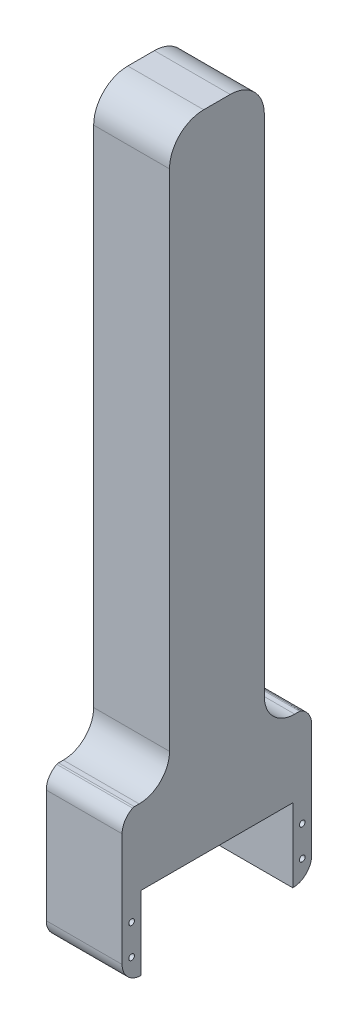
ISO-10303-21;
HEADER;
FILE_DESCRIPTION(('STEP AP214'),'2;1');
FILE_NAME('part.step','',(''),(''),'','','');
FILE_SCHEMA(('AUTOMOTIVE_DESIGN { 1 0 10303 214 1 1 1 1 }'));
ENDSEC;
DATA;
#1=APPLICATION_CONTEXT('core data for automotive mechanical design processes');
#2=APPLICATION_PROTOCOL_DEFINITION('international standard','automotive_design',2000,#1);
#3=PRODUCT_CONTEXT('',#1,'mechanical');
#4=PRODUCT('Part','Part','',(#3));
#5=PRODUCT_RELATED_PRODUCT_CATEGORY('part','',(#4));
#6=PRODUCT_DEFINITION_FORMATION('','',#4);
#7=PRODUCT_DEFINITION_CONTEXT('part definition',#1,'design');
#8=PRODUCT_DEFINITION('design','',#6,#7);
#9=PRODUCT_DEFINITION_SHAPE('','',#8);
#10=(LENGTH_UNIT() NAMED_UNIT(*) SI_UNIT(.MILLI.,.METRE.));
#11=(NAMED_UNIT(*) PLANE_ANGLE_UNIT() SI_UNIT($,.RADIAN.));
#12=(NAMED_UNIT(*) SI_UNIT($,.STERADIAN.) SOLID_ANGLE_UNIT());
#13=UNCERTAINTY_MEASURE_WITH_UNIT(LENGTH_MEASURE(1.E-05),#10,'distance_accuracy_value','');
#14=(GEOMETRIC_REPRESENTATION_CONTEXT(3) GLOBAL_UNCERTAINTY_ASSIGNED_CONTEXT((#13)) GLOBAL_UNIT_ASSIGNED_CONTEXT((#10,
#11,#12)) REPRESENTATION_CONTEXT('',''));
#15=CARTESIAN_POINT('',(0.,0.,0.));
#16=DIRECTION('',(0.,0.,1.));
#17=DIRECTION('',(1.,0.,0.));
#18=AXIS2_PLACEMENT_3D('',#15,#16,#17);
#19=CARTESIAN_POINT('',(20.,-63.953488372093,46.5891472868217));
#20=DIRECTION('',(0.,0.,1.));
#21=DIRECTION('',(1.,0.,0.));
#22=AXIS2_PLACEMENT_3D('',#19,#20,#21);
#23=PLANE('',#22);
#24=DIRECTION('',(0.,1.,0.));
#25=VECTOR('',#24,1.);
#26=CARTESIAN_POINT('',(20.,-63.953488372093,46.5891472868217));
#27=LINE('',#26,#25);
#28=CARTESIAN_POINT('',(20.,-63.3696868591887,46.5891472868217));
#29=VERTEX_POINT('',#28);
#30=CARTESIAN_POINT('',(20.,-43.953488372093,46.5891472868217));
#31=VERTEX_POINT('',#30);
#32=EDGE_CURVE('E197',#29,#31,#27,.T.);
#33=ORIENTED_EDGE('',*,*,#32,.F.);
#34=DIRECTION('',(-1.,0.,0.));
#35=VECTOR('',#34,1.);
#36=CARTESIAN_POINT('',(20.,-63.3696868591887,46.5891472868217));
#37=LINE('',#36,#35);
#38=CARTESIAN_POINT('',(0.,-63.3696868591887,46.5891472868217));
#39=VERTEX_POINT('',#38);
#40=EDGE_CURVE('E181',#29,#39,#37,.T.);
#41=ORIENTED_EDGE('',*,*,#40,.T.);
#42=DIRECTION('',(0.,1.,0.));
#43=VECTOR('',#42,1.);
#44=CARTESIAN_POINT('',(0.,-63.953488372093,46.5891472868217));
#45=LINE('',#44,#43);
#46=CARTESIAN_POINT('',(0.,-43.953488372093,46.5891472868217));
#47=VERTEX_POINT('',#46);
#48=EDGE_CURVE('E238',#39,#47,#45,.T.);
#49=ORIENTED_EDGE('',*,*,#48,.T.);
#50=DIRECTION('',(-1.,0.,0.));
#51=VECTOR('',#50,1.);
#52=CARTESIAN_POINT('',(20.,-43.953488372093,46.5891472868217));
#53=LINE('',#52,#51);
#54=EDGE_CURVE('E205',#31,#47,#53,.T.);
#55=ORIENTED_EDGE('',*,*,#54,.F.);
#56=EDGE_LOOP('',(#33,#41,#49,#55));
#57=FACE_BOUND('',#56,.T.);
#58=ADVANCED_FACE('F44',(#57),#23,.F.);
#59=CARTESIAN_POINT('',(20.,-43.953488372093,46.5891472868217));
#60=DIRECTION('',(0.,1.,0.));
#61=DIRECTION('',(0.,0.,1.));
#62=AXIS2_PLACEMENT_3D('',#59,#60,#61);
#63=PLANE('',#62);
#64=DIRECTION('',(0.,0.,-1.));
#65=VECTOR('',#64,1.);
#66=CARTESIAN_POINT('',(0.,-43.953488372093,46.5891472868217));
#67=LINE('',#66,#65);
#68=CARTESIAN_POINT('',(0.,-43.953488372093,6.58914728682172));
#69=VERTEX_POINT('',#68);
#70=EDGE_CURVE('E240',#47,#69,#67,.T.);
#71=ORIENTED_EDGE('',*,*,#70,.T.);
#72=DIRECTION('',(-1.,0.,0.));
#73=VECTOR('',#72,1.);
#74=CARTESIAN_POINT('',(20.,-43.953488372093,6.58914728682172));
#75=LINE('',#74,#73);
#76=CARTESIAN_POINT('',(20.,-43.953488372093,6.58914728682172));
#77=VERTEX_POINT('',#76);
#78=EDGE_CURVE('E284',#77,#69,#75,.T.);
#79=ORIENTED_EDGE('',*,*,#78,.F.);
#80=DIRECTION('',(0.,0.,-1.));
#81=VECTOR('',#80,1.);
#82=CARTESIAN_POINT('',(20.,-43.953488372093,46.5891472868217));
#83=LINE('',#82,#81);
#84=EDGE_CURVE('E206',#31,#77,#83,.T.);
#85=ORIENTED_EDGE('',*,*,#84,.F.);
#86=ORIENTED_EDGE('',*,*,#54,.T.);
#87=EDGE_LOOP('',(#71,#79,#85,#86));
#88=FACE_BOUND('',#87,.T.);
#89=ADVANCED_FACE('F384',(#88),#63,.F.);
#90=CARTESIAN_POINT('',(20.,-43.953488372093,6.58914728682172));
#91=DIRECTION('',(0.,0.,-1.));
#92=DIRECTION('',(-1.,0.,0.));
#93=AXIS2_PLACEMENT_3D('',#90,#91,#92);
#94=PLANE('',#93);
#95=DIRECTION('',(0.,-1.,0.));
#96=VECTOR('',#95,1.);
#97=CARTESIAN_POINT('',(0.,-43.953488372093,6.58914728682172));
#98=LINE('',#97,#96);
#99=CARTESIAN_POINT('',(0.,-63.3696868591887,6.58914728682176));
#100=VERTEX_POINT('',#99);
#101=EDGE_CURVE('E243',#69,#100,#98,.T.);
#102=ORIENTED_EDGE('',*,*,#101,.T.);
#103=DIRECTION('',(-1.,0.,0.));
#104=VECTOR('',#103,1.);
#105=CARTESIAN_POINT('',(20.,-63.3696868591887,6.58914728682176));
#106=LINE('',#105,#104);
#107=CARTESIAN_POINT('',(20.,-63.3696868591887,6.58914728682176));
#108=VERTEX_POINT('',#107);
#109=EDGE_CURVE('E342',#108,#100,#106,.T.);
#110=ORIENTED_EDGE('',*,*,#109,.F.);
#111=DIRECTION('',(0.,-1.,0.));
#112=VECTOR('',#111,1.);
#113=CARTESIAN_POINT('',(20.,-43.953488372093,6.58914728682172));
#114=LINE('',#113,#112);
#115=EDGE_CURVE('E209',#77,#108,#114,.T.);
#116=ORIENTED_EDGE('',*,*,#115,.F.);
#117=ORIENTED_EDGE('',*,*,#78,.T.);
#118=EDGE_LOOP('',(#102,#110,#116,#117));
#119=FACE_BOUND('',#118,.T.);
#120=ADVANCED_FACE('F389',(#119),#94,.F.);
#121=CARTESIAN_POINT('',(20.,-23.953488372093,4.58914728682179));
#122=DIRECTION('',(0.,-1.,0.));
#123=DIRECTION('',(0.,0.,-1.));
#124=AXIS2_PLACEMENT_3D('',#121,#122,#123);
#125=PLANE('',#124);
#126=DIRECTION('',(0.,0.,1.));
#127=VECTOR('',#126,1.);
#128=CARTESIAN_POINT('',(20.,-23.953488372093,4.58914728682179));
#129=LINE('',#128,#127);
#130=CARTESIAN_POINT('',(20.,-23.953488372093,4.81006005177351));
#131=VERTEX_POINT('',#130);
#132=CARTESIAN_POINT('',(20.,-23.953488372093,6.08914728682167));
#133=VERTEX_POINT('',#132);
#134=EDGE_CURVE('E219',#131,#133,#129,.T.);
#135=ORIENTED_EDGE('',*,*,#134,.F.);
#136=DIRECTION('',(1.,0.,0.));
#137=VECTOR('',#136,1.);
#138=CARTESIAN_POINT('',(0.,-23.953488372093,4.81006005177351));
#139=LINE('',#138,#137);
#140=CARTESIAN_POINT('',(0.,-23.953488372093,4.81006005177351));
#141=VERTEX_POINT('',#140);
#142=EDGE_CURVE('E295',#131,#141,#139,.F.);
#143=ORIENTED_EDGE('',*,*,#142,.T.);
#144=DIRECTION('',(0.,0.,1.));
#145=VECTOR('',#144,1.);
#146=CARTESIAN_POINT('',(0.,-23.953488372093,4.58914728682179));
#147=LINE('',#146,#145);
#148=CARTESIAN_POINT('',(0.,-23.953488372093,6.08914728682167));
#149=VERTEX_POINT('',#148);
#150=EDGE_CURVE('E246',#141,#149,#147,.T.);
#151=ORIENTED_EDGE('',*,*,#150,.T.);
#152=DIRECTION('',(-1.,0.,0.));
#153=VECTOR('',#152,1.);
#154=CARTESIAN_POINT('',(20.,-23.953488372093,6.08914728682167));
#155=LINE('',#154,#153);
#156=EDGE_CURVE('E281',#133,#149,#155,.T.);
#157=ORIENTED_EDGE('',*,*,#156,.F.);
#158=EDGE_LOOP('',(#135,#143,#151,#157));
#159=FACE_BOUND('',#158,.T.);
#160=ADVANCED_FACE('F447',(#159),#125,.F.);
#161=CARTESIAN_POINT('',(20.,-15.953488372093,6.08914728682172));
#162=DIRECTION('',(-1.,0.,0.));
#163=DIRECTION('',(0.,0.,1.));
#164=AXIS2_PLACEMENT_3D('',#161,#162,#163);
#165=CYLINDRICAL_SURFACE('',#164,8.);
#166=CARTESIAN_POINT('',(0.,-15.953488372093,6.08914728682172));
#167=DIRECTION('',(-1.,0.,0.));
#168=DIRECTION('',(0.,0.,-1.));
#169=AXIS2_PLACEMENT_3D('',#166,#167,#168);
#170=CIRCLE('',#169,8.);
#171=CARTESIAN_POINT('',(0.,-15.953488372093,14.0891472868217));
#172=VERTEX_POINT('',#171);
#173=EDGE_CURVE('E248',#149,#172,#170,.T.);
#174=ORIENTED_EDGE('',*,*,#173,.T.);
#175=DIRECTION('',(-1.,0.,0.));
#176=VECTOR('',#175,1.);
#177=CARTESIAN_POINT('',(20.,-15.953488372093,14.0891472868217));
#178=LINE('',#177,#176);
#179=CARTESIAN_POINT('',(20.,-15.953488372093,14.0891472868217));
#180=VERTEX_POINT('',#179);
#181=EDGE_CURVE('E278',#180,#172,#178,.T.);
#182=ORIENTED_EDGE('',*,*,#181,.F.);
#183=CARTESIAN_POINT('',(20.,-15.953488372093,6.08914728682172));
#184=DIRECTION('',(-1.,0.,0.));
#185=DIRECTION('',(0.,0.,-1.));
#186=AXIS2_PLACEMENT_3D('',#183,#184,#185);
#187=CIRCLE('',#186,8.);
#188=EDGE_CURVE('E221',#133,#180,#187,.T.);
#189=ORIENTED_EDGE('',*,*,#188,.F.);
#190=ORIENTED_EDGE('',*,*,#156,.T.);
#191=EDGE_LOOP('',(#174,#182,#189,#190));
#192=FACE_BOUND('',#191,.T.);
#193=ADVANCED_FACE('F442',(#192),#165,.F.);
#194=CARTESIAN_POINT('',(20.,-15.953488372093,14.0891472868217));
#195=DIRECTION('',(0.,0.,1.));
#196=DIRECTION('',(1.,0.,0.));
#197=AXIS2_PLACEMENT_3D('',#194,#195,#196);
#198=PLANE('',#197);
#199=DIRECTION('',(0.,1.,0.));
#200=VECTOR('',#199,1.);
#201=CARTESIAN_POINT('',(0.,-15.953488372093,14.0891472868217));
#202=LINE('',#201,#200);
#203=CARTESIAN_POINT('',(0.,117.046511627907,14.0891472868217));
#204=VERTEX_POINT('',#203);
#205=EDGE_CURVE('E250',#172,#204,#202,.T.);
#206=ORIENTED_EDGE('',*,*,#205,.T.);
#207=DIRECTION('',(-1.,0.,0.));
#208=VECTOR('',#207,1.);
#209=CARTESIAN_POINT('',(20.,117.046511627907,14.0891472868217));
#210=LINE('',#209,#208);
#211=CARTESIAN_POINT('',(20.,117.046511627907,14.0891472868217));
#212=VERTEX_POINT('',#211);
#213=EDGE_CURVE('E275',#212,#204,#210,.T.);
#214=ORIENTED_EDGE('',*,*,#213,.F.);
#215=DIRECTION('',(0.,1.,0.));
#216=VECTOR('',#215,1.);
#217=CARTESIAN_POINT('',(20.,-15.953488372093,14.0891472868217));
#218=LINE('',#217,#216);
#219=EDGE_CURVE('E223',#180,#212,#218,.T.);
#220=ORIENTED_EDGE('',*,*,#219,.F.);
#221=ORIENTED_EDGE('',*,*,#181,.T.);
#222=EDGE_LOOP('',(#206,#214,#220,#221));
#223=FACE_BOUND('',#222,.T.);
#224=ADVANCED_FACE('F437',(#223),#198,.F.);
#225=CARTESIAN_POINT('',(20.,117.046511627907,23.0891472868217));
#226=DIRECTION('',(-1.,0.,0.));
#227=DIRECTION('',(0.,0.,1.));
#228=AXIS2_PLACEMENT_3D('',#225,#226,#227);
#229=CYLINDRICAL_SURFACE('',#228,9.);
#230=CARTESIAN_POINT('',(0.,117.046511627907,23.0891472868217));
#231=DIRECTION('',(1.,0.,0.));
#232=DIRECTION('',(0.,0.,-1.));
#233=AXIS2_PLACEMENT_3D('',#230,#231,#232);
#234=CIRCLE('',#233,9.);
#235=CARTESIAN_POINT('',(0.,126.046511627907,23.0891472868218));
#236=VERTEX_POINT('',#235);
#237=EDGE_CURVE('E252',#204,#236,#234,.T.);
#238=ORIENTED_EDGE('',*,*,#237,.T.);
#239=DIRECTION('',(-1.,0.,0.));
#240=VECTOR('',#239,1.);
#241=CARTESIAN_POINT('',(20.,126.046511627907,23.0891472868218));
#242=LINE('',#241,#240);
#243=CARTESIAN_POINT('',(20.,126.046511627907,23.0891472868218));
#244=VERTEX_POINT('',#243);
#245=EDGE_CURVE('E272',#244,#236,#242,.T.);
#246=ORIENTED_EDGE('',*,*,#245,.F.);
#247=CARTESIAN_POINT('',(20.,117.046511627907,23.0891472868217));
#248=DIRECTION('',(1.,0.,0.));
#249=DIRECTION('',(0.,0.,-1.));
#250=AXIS2_PLACEMENT_3D('',#247,#248,#249);
#251=CIRCLE('',#250,9.);
#252=EDGE_CURVE('E225',#212,#244,#251,.T.);
#253=ORIENTED_EDGE('',*,*,#252,.F.);
#254=ORIENTED_EDGE('',*,*,#213,.T.);
#255=EDGE_LOOP('',(#238,#246,#253,#254));
#256=FACE_BOUND('',#255,.T.);
#257=ADVANCED_FACE('F433',(#256),#229,.T.);
#258=CARTESIAN_POINT('',(20.,126.046511627907,30.0891472868217));
#259=DIRECTION('',(0.,-1.,0.));
#260=DIRECTION('',(0.,0.,-1.));
#261=AXIS2_PLACEMENT_3D('',#258,#259,#260);
#262=PLANE('',#261);
#263=DIRECTION('',(0.,0.,1.));
#264=VECTOR('',#263,1.);
#265=CARTESIAN_POINT('',(0.,126.046511627907,30.0891472868217));
#266=LINE('',#265,#264);
#267=CARTESIAN_POINT('',(0.,126.046511627907,30.0891472868217));
#268=VERTEX_POINT('',#267);
#269=EDGE_CURVE('E254',#236,#268,#266,.T.);
#270=ORIENTED_EDGE('',*,*,#269,.T.);
#271=DIRECTION('',(-1.,0.,0.));
#272=VECTOR('',#271,1.);
#273=CARTESIAN_POINT('',(20.,126.046511627907,30.0891472868217));
#274=LINE('',#273,#272);
#275=CARTESIAN_POINT('',(20.,126.046511627907,30.0891472868217));
#276=VERTEX_POINT('',#275);
#277=EDGE_CURVE('E269',#276,#268,#274,.T.);
#278=ORIENTED_EDGE('',*,*,#277,.F.);
#279=DIRECTION('',(0.,0.,1.));
#280=VECTOR('',#279,1.);
#281=CARTESIAN_POINT('',(20.,126.046511627907,30.0891472868217));
#282=LINE('',#281,#280);
#283=EDGE_CURVE('E227',#244,#276,#282,.T.);
#284=ORIENTED_EDGE('',*,*,#283,.F.);
#285=ORIENTED_EDGE('',*,*,#245,.T.);
#286=EDGE_LOOP('',(#270,#278,#284,#285));
#287=FACE_BOUND('',#286,.T.);
#288=ADVANCED_FACE('F428',(#287),#262,.F.);
#289=CARTESIAN_POINT('',(20.,117.046511627907,30.0891472868217));
#290=DIRECTION('',(-1.,0.,0.));
#291=DIRECTION('',(0.,0.,1.));
#292=AXIS2_PLACEMENT_3D('',#289,#290,#291);
#293=CYLINDRICAL_SURFACE('',#292,9.);
#294=CARTESIAN_POINT('',(0.,117.046511627907,30.0891472868217));
#295=DIRECTION('',(1.,0.,0.));
#296=DIRECTION('',(0.,0.,-1.));
#297=AXIS2_PLACEMENT_3D('',#294,#295,#296);
#298=CIRCLE('',#297,9.);
#299=CARTESIAN_POINT('',(0.,117.046511627907,39.0891472868217));
#300=VERTEX_POINT('',#299);
#301=EDGE_CURVE('E256',#268,#300,#298,.T.);
#302=ORIENTED_EDGE('',*,*,#301,.T.);
#303=DIRECTION('',(-1.,0.,0.));
#304=VECTOR('',#303,1.);
#305=CARTESIAN_POINT('',(20.,117.046511627907,39.0891472868217));
#306=LINE('',#305,#304);
#307=CARTESIAN_POINT('',(20.,117.046511627907,39.0891472868217));
#308=VERTEX_POINT('',#307);
#309=EDGE_CURVE('E266',#308,#300,#306,.T.);
#310=ORIENTED_EDGE('',*,*,#309,.F.);
#311=CARTESIAN_POINT('',(20.,117.046511627907,30.0891472868217));
#312=DIRECTION('',(1.,0.,0.));
#313=DIRECTION('',(0.,0.,-1.));
#314=AXIS2_PLACEMENT_3D('',#311,#312,#313);
#315=CIRCLE('',#314,9.);
#316=EDGE_CURVE('E229',#276,#308,#315,.T.);
#317=ORIENTED_EDGE('',*,*,#316,.F.);
#318=ORIENTED_EDGE('',*,*,#277,.T.);
#319=EDGE_LOOP('',(#302,#310,#317,#318));
#320=FACE_BOUND('',#319,.T.);
#321=ADVANCED_FACE('F422',(#320),#293,.T.);
#322=CARTESIAN_POINT('',(20.,-15.953488372093,39.0891472868217));
#323=DIRECTION('',(0.,0.,-1.));
#324=DIRECTION('',(-1.,0.,0.));
#325=AXIS2_PLACEMENT_3D('',#322,#323,#324);
#326=PLANE('',#325);
#327=DIRECTION('',(0.,-1.,0.));
#328=VECTOR('',#327,1.);
#329=CARTESIAN_POINT('',(0.,-15.953488372093,39.0891472868217));
#330=LINE('',#329,#328);
#331=CARTESIAN_POINT('',(0.,-15.953488372093,39.0891472868217));
#332=VERTEX_POINT('',#331);
#333=EDGE_CURVE('E258',#300,#332,#330,.T.);
#334=ORIENTED_EDGE('',*,*,#333,.T.);
#335=DIRECTION('',(-1.,0.,0.));
#336=VECTOR('',#335,1.);
#337=CARTESIAN_POINT('',(20.,-15.953488372093,39.0891472868217));
#338=LINE('',#337,#336);
#339=CARTESIAN_POINT('',(20.,-15.953488372093,39.0891472868217));
#340=VERTEX_POINT('',#339);
#341=EDGE_CURVE('E263',#340,#332,#338,.T.);
#342=ORIENTED_EDGE('',*,*,#341,.F.);
#343=DIRECTION('',(0.,-1.,0.));
#344=VECTOR('',#343,1.);
#345=CARTESIAN_POINT('',(20.,-15.953488372093,39.0891472868217));
#346=LINE('',#345,#344);
#347=EDGE_CURVE('E231',#308,#340,#346,.T.);
#348=ORIENTED_EDGE('',*,*,#347,.F.);
#349=ORIENTED_EDGE('',*,*,#309,.T.);
#350=EDGE_LOOP('',(#334,#342,#348,#349));
#351=FACE_BOUND('',#350,.T.);
#352=ADVANCED_FACE('F418',(#351),#326,.F.);
#353=CARTESIAN_POINT('',(20.,-15.953488372093,47.0891472868217));
#354=DIRECTION('',(-1.,0.,0.));
#355=DIRECTION('',(0.,0.,1.));
#356=AXIS2_PLACEMENT_3D('',#353,#354,#355);
#357=CYLINDRICAL_SURFACE('',#356,8.);
#358=CARTESIAN_POINT('',(0.,-15.953488372093,47.0891472868217));
#359=DIRECTION('',(-1.,0.,0.));
#360=DIRECTION('',(0.,0.,-1.));
#361=AXIS2_PLACEMENT_3D('',#358,#359,#360);
#362=CIRCLE('',#361,8.);
#363=CARTESIAN_POINT('',(0.,-23.953488372093,47.0891472868218));
#364=VERTEX_POINT('',#363);
#365=EDGE_CURVE('E211',#332,#364,#362,.T.);
#366=ORIENTED_EDGE('',*,*,#365,.T.);
#367=DIRECTION('',(-1.,0.,0.));
#368=VECTOR('',#367,1.);
#369=CARTESIAN_POINT('',(20.,-23.953488372093,47.0891472868218));
#370=LINE('',#369,#368);
#371=CARTESIAN_POINT('',(20.,-23.953488372093,47.0891472868218));
#372=VERTEX_POINT('',#371);
#373=EDGE_CURVE('E237',#372,#364,#370,.T.);
#374=ORIENTED_EDGE('',*,*,#373,.F.);
#375=CARTESIAN_POINT('',(20.,-15.953488372093,47.0891472868217));
#376=DIRECTION('',(-1.,0.,0.));
#377=DIRECTION('',(0.,0.,-1.));
#378=AXIS2_PLACEMENT_3D('',#375,#376,#377);
#379=CIRCLE('',#378,8.);
#380=EDGE_CURVE('E233',#340,#372,#379,.T.);
#381=ORIENTED_EDGE('',*,*,#380,.F.);
#382=ORIENTED_EDGE('',*,*,#341,.T.);
#383=EDGE_LOOP('',(#366,#374,#381,#382));
#384=FACE_BOUND('',#383,.T.);
#385=ADVANCED_FACE('F414',(#384),#357,.F.);
#386=CARTESIAN_POINT('',(20.,-23.953488372093,48.5891472868217));
#387=DIRECTION('',(0.,-1.,0.));
#388=DIRECTION('',(0.,0.,-1.));
#389=AXIS2_PLACEMENT_3D('',#386,#387,#388);
#390=PLANE('',#389);
#391=DIRECTION('',(0.,0.,1.));
#392=VECTOR('',#391,1.);
#393=CARTESIAN_POINT('',(0.,-23.953488372093,48.5891472868217));
#394=LINE('',#393,#392);
#395=CARTESIAN_POINT('',(0.,-23.953488372093,48.36823452187));
#396=VERTEX_POINT('',#395);
#397=EDGE_CURVE('E207',#364,#396,#394,.T.);
#398=ORIENTED_EDGE('',*,*,#397,.T.);
#399=DIRECTION('',(1.,0.,0.));
#400=VECTOR('',#399,1.);
#401=CARTESIAN_POINT('',(20.,-23.953488372093,48.36823452187));
#402=LINE('',#401,#400);
#403=CARTESIAN_POINT('',(20.,-23.953488372093,48.36823452187));
#404=VERTEX_POINT('',#403);
#405=EDGE_CURVE('E52',#396,#404,#402,.T.);
#406=ORIENTED_EDGE('',*,*,#405,.T.);
#407=DIRECTION('',(0.,0.,1.));
#408=VECTOR('',#407,1.);
#409=CARTESIAN_POINT('',(20.,-23.953488372093,48.5891472868217));
#410=LINE('',#409,#408);
#411=EDGE_CURVE('E235',#372,#404,#410,.T.);
#412=ORIENTED_EDGE('',*,*,#411,.F.);
#413=ORIENTED_EDGE('',*,*,#373,.T.);
#414=EDGE_LOOP('',(#398,#406,#412,#413));
#415=FACE_BOUND('',#414,.T.);
#416=ADVANCED_FACE('F380',(#415),#390,.F.);
#417=CARTESIAN_POINT('',(20.,-55.953488372093,4.58914728682172));
#418=DIRECTION('',(-1.,0.,0.));
#419=DIRECTION('',(0.,0.,1.));
#420=AXIS2_PLACEMENT_3D('',#417,#418,#419);
#421=PLANE('',#420);
#422=ORIENTED_EDGE('',*,*,#411,.T.);
#423=CARTESIAN_POINT('',(20.,-24.953488372093,48.36823452187));
#424=DIRECTION('',(-1.,0.,0.));
#425=DIRECTION('',(0.,0.,1.));
#426=AXIS2_PLACEMENT_3D('',#423,#424,#425);
#427=CIRCLE('',#426,1.);
#428=CARTESIAN_POINT('',(20.,-24.0578444483541,48.813006330632));
#429=VERTEX_POINT('',#428);
#430=EDGE_CURVE('E13',#404,#429,#427,.F.);
#431=ORIENTED_EDGE('',*,*,#430,.T.);
#432=CARTESIAN_POINT('',(20.,-28.5360640670489,46.5891472868217));
#433=DIRECTION('',(-1.,0.,0.));
#434=DIRECTION('',(0.,0.,1.));
#435=AXIS2_PLACEMENT_3D('',#432,#433,#434);
#436=CIRCLE('',#435,5.);
#437=CARTESIAN_POINT('',(20.,-28.5360640670489,51.5891472868217));
#438=VERTEX_POINT('',#437);
#439=EDGE_CURVE('E304',#429,#438,#436,.F.);
#440=ORIENTED_EDGE('',*,*,#439,.T.);
#441=DIRECTION('',(0.,-1.,0.));
#442=VECTOR('',#441,1.);
#443=CARTESIAN_POINT('',(20.,-43.953488372093,51.5891472868217));
#444=LINE('',#443,#442);
#445=CARTESIAN_POINT('',(20.,-58.3696868591887,51.5891472868217));
#446=VERTEX_POINT('',#445);
#447=EDGE_CURVE('E192',#438,#446,#444,.T.);
#448=ORIENTED_EDGE('',*,*,#447,.T.);
#449=CARTESIAN_POINT('',(20.,-58.3696868591887,46.5891472868217));
#450=DIRECTION('',(1.,0.,0.));
#451=DIRECTION('',(0.,0.,-1.));
#452=AXIS2_PLACEMENT_3D('',#449,#450,#451);
#453=CIRCLE('',#452,5.);
#454=EDGE_CURVE('E185',#446,#29,#453,.T.);
#455=ORIENTED_EDGE('',*,*,#454,.T.);
#456=ORIENTED_EDGE('',*,*,#32,.T.);
#457=ORIENTED_EDGE('',*,*,#84,.T.);
#458=ORIENTED_EDGE('',*,*,#115,.T.);
#459=CARTESIAN_POINT('',(20.,-58.3696868591887,6.58914728682172));
#460=DIRECTION('',(1.,0.,0.));
#461=DIRECTION('',(0.,0.,1.));
#462=AXIS2_PLACEMENT_3D('',#459,#460,#461);
#463=CIRCLE('',#462,5.);
#464=CARTESIAN_POINT('',(20.,-58.3696868591887,1.58914728682172));
#465=VERTEX_POINT('',#464);
#466=EDGE_CURVE('E331',#108,#465,#463,.T.);
#467=ORIENTED_EDGE('',*,*,#466,.T.);
#468=DIRECTION('',(0.,1.,0.));
#469=VECTOR('',#468,1.);
#470=CARTESIAN_POINT('',(20.,-43.953488372093,1.58914728682172));
#471=LINE('',#470,#469);
#472=CARTESIAN_POINT('',(20.,-28.5360640670489,1.58914728682172));
#473=VERTEX_POINT('',#472);
#474=EDGE_CURVE('E334',#465,#473,#471,.T.);
#475=ORIENTED_EDGE('',*,*,#474,.T.);
#476=CARTESIAN_POINT('',(20.,-28.5360640670489,6.58914728682172));
#477=DIRECTION('',(-1.,0.,0.));
#478=DIRECTION('',(0.,0.,1.));
#479=AXIS2_PLACEMENT_3D('',#476,#477,#478);
#480=CIRCLE('',#479,5.);
#481=CARTESIAN_POINT('',(20.,-24.0578444483541,4.36528824301146));
#482=VERTEX_POINT('',#481);
#483=EDGE_CURVE('E292',#473,#482,#480,.F.);
#484=ORIENTED_EDGE('',*,*,#483,.T.);
#485=CARTESIAN_POINT('',(20.,-24.953488372093,4.81006005177351));
#486=DIRECTION('',(-1.,0.,0.));
#487=DIRECTION('',(0.,0.,1.));
#488=AXIS2_PLACEMENT_3D('',#485,#486,#487);
#489=CIRCLE('',#488,1.);
#490=EDGE_CURVE('E302',#482,#131,#489,.F.);
#491=ORIENTED_EDGE('',*,*,#490,.T.);
#492=ORIENTED_EDGE('',*,*,#134,.T.);
#493=ORIENTED_EDGE('',*,*,#188,.T.);
#494=ORIENTED_EDGE('',*,*,#219,.T.);
#495=ORIENTED_EDGE('',*,*,#252,.T.);
#496=ORIENTED_EDGE('',*,*,#283,.T.);
#497=ORIENTED_EDGE('',*,*,#316,.T.);
#498=ORIENTED_EDGE('',*,*,#347,.T.);
#499=ORIENTED_EDGE('',*,*,#380,.T.);
#500=EDGE_LOOP('',(#422,#431,#440,#448,#455,#456,#457,#458,#467,#475,#484,#491,#492,#493,#494,
#495,#496,#497,#498,#499));
#501=FACE_BOUND('',#500,.T.);
#502=CARTESIAN_POINT('',(20.,-57.953488372093,4.08914728682172));
#503=DIRECTION('',(-1.,0.,0.));
#504=DIRECTION('',(0.,0.,-1.));
#505=AXIS2_PLACEMENT_3D('',#502,#503,#504);
#506=CIRCLE('',#505,0.75);
#507=CARTESIAN_POINT('',(20.,-57.953488372093,3.33914728682172));
#508=VERTEX_POINT('',#507);
#509=EDGE_CURVE('E347',#508,#508,#506,.T.);
#510=ORIENTED_EDGE('',*,*,#509,.T.);
#511=EDGE_LOOP('',(#510));
#512=FACE_BOUND('',#511,.T.);
#513=CARTESIAN_POINT('',(20.,-57.953488372093,49.0891472868217));
#514=DIRECTION('',(-1.,0.,0.));
#515=DIRECTION('',(0.,0.,1.));
#516=AXIS2_PLACEMENT_3D('',#513,#514,#515);
#517=CIRCLE('',#516,0.749999999999999);
#518=CARTESIAN_POINT('',(20.,-57.953488372093,49.8391472868217));
#519=VERTEX_POINT('',#518);
#520=EDGE_CURVE('E353',#519,#519,#517,.T.);
#521=ORIENTED_EDGE('',*,*,#520,.T.);
#522=EDGE_LOOP('',(#521));
#523=FACE_BOUND('',#522,.T.);
#524=CARTESIAN_POINT('',(20.,-49.953488372093,49.0891472868217));
#525=DIRECTION('',(-1.,0.,0.));
#526=DIRECTION('',(0.,0.,-1.));
#527=AXIS2_PLACEMENT_3D('',#524,#525,#526);
#528=CIRCLE('',#527,0.749999999999999);
#529=CARTESIAN_POINT('',(20.,-49.953488372093,48.3391472868217));
#530=VERTEX_POINT('',#529);
#531=EDGE_CURVE('E359',#530,#530,#528,.T.);
#532=ORIENTED_EDGE('',*,*,#531,.T.);
#533=EDGE_LOOP('',(#532));
#534=FACE_BOUND('',#533,.T.);
#535=CARTESIAN_POINT('',(20.,-49.953488372093,4.08914728682172));
#536=DIRECTION('',(-1.,0.,0.));
#537=DIRECTION('',(0.,0.,1.));
#538=AXIS2_PLACEMENT_3D('',#535,#536,#537);
#539=CIRCLE('',#538,0.75);
#540=CARTESIAN_POINT('',(20.,-49.953488372093,4.83914728682172));
#541=VERTEX_POINT('',#540);
#542=EDGE_CURVE('E241',#541,#541,#539,.T.);
#543=ORIENTED_EDGE('',*,*,#542,.T.);
#544=EDGE_LOOP('',(#543));
#545=FACE_BOUND('',#544,.T.);
#546=ADVANCED_FACE('F195',(#501,#512,#523,#534,#545),#421,.F.);
#547=CARTESIAN_POINT('',(0.,-55.953488372093,4.58914728682172));
#548=DIRECTION('',(-1.,0.,0.));
#549=DIRECTION('',(0.,0.,1.));
#550=AXIS2_PLACEMENT_3D('',#547,#548,#549);
#551=PLANE('',#550);
#552=CARTESIAN_POINT('',(0.,-28.5360640670489,46.5891472868217));
#553=DIRECTION('',(-1.,0.,0.));
#554=DIRECTION('',(0.,0.,1.));
#555=AXIS2_PLACEMENT_3D('',#552,#553,#554);
#556=CIRCLE('',#555,5.);
#557=CARTESIAN_POINT('',(0.,-28.5360640670489,51.5891472868217));
#558=VERTEX_POINT('',#557);
#559=CARTESIAN_POINT('',(0.,-24.0578444483541,48.813006330632));
#560=VERTEX_POINT('',#559);
#561=EDGE_CURVE('E308',#558,#560,#556,.T.);
#562=ORIENTED_EDGE('',*,*,#561,.T.);
#563=CARTESIAN_POINT('',(0.,-24.953488372093,48.36823452187));
#564=DIRECTION('',(-1.,0.,0.));
#565=DIRECTION('',(0.,0.,1.));
#566=AXIS2_PLACEMENT_3D('',#563,#564,#565);
#567=CIRCLE('',#566,1.);
#568=EDGE_CURVE('E66',#560,#396,#567,.T.);
#569=ORIENTED_EDGE('',*,*,#568,.T.);
#570=ORIENTED_EDGE('',*,*,#397,.F.);
#571=ORIENTED_EDGE('',*,*,#365,.F.);
#572=ORIENTED_EDGE('',*,*,#333,.F.);
#573=ORIENTED_EDGE('',*,*,#301,.F.);
#574=ORIENTED_EDGE('',*,*,#269,.F.);
#575=ORIENTED_EDGE('',*,*,#237,.F.);
#576=ORIENTED_EDGE('',*,*,#205,.F.);
#577=ORIENTED_EDGE('',*,*,#173,.F.);
#578=ORIENTED_EDGE('',*,*,#150,.F.);
#579=CARTESIAN_POINT('',(0.,-24.953488372093,4.81006005177351));
#580=DIRECTION('',(-1.,0.,0.));
#581=DIRECTION('',(0.,0.,1.));
#582=AXIS2_PLACEMENT_3D('',#579,#580,#581);
#583=CIRCLE('',#582,1.);
#584=CARTESIAN_POINT('',(0.,-24.0578444483541,4.36528824301146));
#585=VERTEX_POINT('',#584);
#586=EDGE_CURVE('E298',#141,#585,#583,.T.);
#587=ORIENTED_EDGE('',*,*,#586,.T.);
#588=CARTESIAN_POINT('',(0.,-28.5360640670489,6.58914728682172));
#589=DIRECTION('',(-1.,0.,0.));
#590=DIRECTION('',(0.,0.,1.));
#591=AXIS2_PLACEMENT_3D('',#588,#589,#590);
#592=CIRCLE('',#591,5.);
#593=CARTESIAN_POINT('',(0.,-28.5360640670489,1.58914728682172));
#594=VERTEX_POINT('',#593);
#595=EDGE_CURVE('E288',#585,#594,#592,.T.);
#596=ORIENTED_EDGE('',*,*,#595,.T.);
#597=DIRECTION('',(0.,1.,0.));
#598=VECTOR('',#597,1.);
#599=CARTESIAN_POINT('',(0.,-43.953488372093,1.58914728682172));
#600=LINE('',#599,#598);
#601=CARTESIAN_POINT('',(0.,-58.3696868591887,1.58914728682172));
#602=VERTEX_POINT('',#601);
#603=EDGE_CURVE('E335',#602,#594,#600,.T.);
#604=ORIENTED_EDGE('',*,*,#603,.F.);
#605=CARTESIAN_POINT('',(0.,-58.3696868591887,6.58914728682172));
#606=DIRECTION('',(1.,0.,0.));
#607=DIRECTION('',(0.,0.,1.));
#608=AXIS2_PLACEMENT_3D('',#605,#606,#607);
#609=CIRCLE('',#608,5.);
#610=EDGE_CURVE('E329',#100,#602,#609,.T.);
#611=ORIENTED_EDGE('',*,*,#610,.F.);
#612=ORIENTED_EDGE('',*,*,#101,.F.);
#613=ORIENTED_EDGE('',*,*,#70,.F.);
#614=ORIENTED_EDGE('',*,*,#48,.F.);
#615=CARTESIAN_POINT('',(0.,-58.3696868591887,46.5891472868217));
#616=DIRECTION('',(1.,0.,0.));
#617=DIRECTION('',(0.,0.,-1.));
#618=AXIS2_PLACEMENT_3D('',#615,#616,#617);
#619=CIRCLE('',#618,5.);
#620=CARTESIAN_POINT('',(0.,-58.3696868591887,51.5891472868217));
#621=VERTEX_POINT('',#620);
#622=EDGE_CURVE('E187',#621,#39,#619,.T.);
#623=ORIENTED_EDGE('',*,*,#622,.F.);
#624=DIRECTION('',(0.,-1.,0.));
#625=VECTOR('',#624,1.);
#626=CARTESIAN_POINT('',(0.,-43.953488372093,51.5891472868217));
#627=LINE('',#626,#625);
#628=EDGE_CURVE('E201',#558,#621,#627,.T.);
#629=ORIENTED_EDGE('',*,*,#628,.F.);
#630=EDGE_LOOP('',(#562,#569,#570,#571,#572,#573,#574,#575,#576,#577,#578,#587,#596,#604,#611,
#612,#613,#614,#623,#629));
#631=FACE_BOUND('',#630,.T.);
#632=CARTESIAN_POINT('',(0.,-57.953488372093,4.08914728682172));
#633=DIRECTION('',(-1.,0.,0.));
#634=DIRECTION('',(0.,0.,-1.));
#635=AXIS2_PLACEMENT_3D('',#632,#633,#634);
#636=CIRCLE('',#635,0.75);
#637=CARTESIAN_POINT('',(0.,-57.953488372093,3.33914728682172));
#638=VERTEX_POINT('',#637);
#639=EDGE_CURVE('E350',#638,#638,#636,.T.);
#640=ORIENTED_EDGE('',*,*,#639,.F.);
#641=EDGE_LOOP('',(#640));
#642=FACE_BOUND('',#641,.T.);
#643=CARTESIAN_POINT('',(0.,-57.953488372093,49.0891472868217));
#644=DIRECTION('',(-1.,0.,0.));
#645=DIRECTION('',(0.,0.,1.));
#646=AXIS2_PLACEMENT_3D('',#643,#644,#645);
#647=CIRCLE('',#646,0.749999999999999);
#648=CARTESIAN_POINT('',(0.,-57.953488372093,49.8391472868217));
#649=VERTEX_POINT('',#648);
#650=EDGE_CURVE('E356',#649,#649,#647,.T.);
#651=ORIENTED_EDGE('',*,*,#650,.F.);
#652=EDGE_LOOP('',(#651));
#653=FACE_BOUND('',#652,.T.);
#654=CARTESIAN_POINT('',(0.,-49.953488372093,49.0891472868217));
#655=DIRECTION('',(-1.,0.,0.));
#656=DIRECTION('',(0.,0.,-1.));
#657=AXIS2_PLACEMENT_3D('',#654,#655,#656);
#658=CIRCLE('',#657,0.749999999999999);
#659=CARTESIAN_POINT('',(0.,-49.953488372093,48.3391472868217));
#660=VERTEX_POINT('',#659);
#661=EDGE_CURVE('E344',#660,#660,#658,.T.);
#662=ORIENTED_EDGE('',*,*,#661,.F.);
#663=EDGE_LOOP('',(#662));
#664=FACE_BOUND('',#663,.T.);
#665=CARTESIAN_POINT('',(0.,-49.953488372093,4.08914728682172));
#666=DIRECTION('',(-1.,0.,0.));
#667=DIRECTION('',(0.,0.,1.));
#668=AXIS2_PLACEMENT_3D('',#665,#666,#667);
#669=CIRCLE('',#668,0.75);
#670=CARTESIAN_POINT('',(0.,-49.953488372093,4.83914728682172));
#671=VERTEX_POINT('',#670);
#672=EDGE_CURVE('E214',#671,#671,#669,.T.);
#673=ORIENTED_EDGE('',*,*,#672,.F.);
#674=EDGE_LOOP('',(#673));
#675=FACE_BOUND('',#674,.T.);
#676=ADVANCED_FACE('F322',(#631,#642,#653,#664,#675),#551,.T.);
#677=CARTESIAN_POINT('',(20.,-49.953488372093,4.08914728682172));
#678=DIRECTION('',(-1.,0.,0.));
#679=DIRECTION('',(0.,0.,1.));
#680=AXIS2_PLACEMENT_3D('',#677,#678,#679);
#681=CYLINDRICAL_SURFACE('',#680,0.75);
#682=ORIENTED_EDGE('',*,*,#542,.F.);
#683=EDGE_LOOP('',(#682));
#684=FACE_BOUND('',#683,.T.);
#685=ORIENTED_EDGE('',*,*,#672,.T.);
#686=EDGE_LOOP('',(#685));
#687=FACE_BOUND('',#686,.T.);
#688=ADVANCED_FACE('F369',(#684,#687),#681,.F.);
#689=CARTESIAN_POINT('',(20.,-49.953488372093,49.0891472868217));
#690=DIRECTION('',(-1.,0.,0.));
#691=DIRECTION('',(0.,0.,1.));
#692=AXIS2_PLACEMENT_3D('',#689,#690,#691);
#693=CYLINDRICAL_SURFACE('',#692,0.749999999999999);
#694=ORIENTED_EDGE('',*,*,#531,.F.);
#695=EDGE_LOOP('',(#694));
#696=FACE_BOUND('',#695,.T.);
#697=ORIENTED_EDGE('',*,*,#661,.T.);
#698=EDGE_LOOP('',(#697));
#699=FACE_BOUND('',#698,.T.);
#700=ADVANCED_FACE('F377',(#696,#699),#693,.F.);
#701=CARTESIAN_POINT('',(20.,-57.953488372093,49.0891472868217));
#702=DIRECTION('',(-1.,0.,0.));
#703=DIRECTION('',(0.,0.,1.));
#704=AXIS2_PLACEMENT_3D('',#701,#702,#703);
#705=CYLINDRICAL_SURFACE('',#704,0.749999999999999);
#706=ORIENTED_EDGE('',*,*,#520,.F.);
#707=EDGE_LOOP('',(#706));
#708=FACE_BOUND('',#707,.T.);
#709=ORIENTED_EDGE('',*,*,#650,.T.);
#710=EDGE_LOOP('',(#709));
#711=FACE_BOUND('',#710,.T.);
#712=ADVANCED_FACE('F598',(#708,#711),#705,.F.);
#713=CARTESIAN_POINT('',(20.,-57.953488372093,4.08914728682172));
#714=DIRECTION('',(-1.,0.,0.));
#715=DIRECTION('',(0.,0.,1.));
#716=AXIS2_PLACEMENT_3D('',#713,#714,#715);
#717=CYLINDRICAL_SURFACE('',#716,0.75);
#718=ORIENTED_EDGE('',*,*,#509,.F.);
#719=EDGE_LOOP('',(#718));
#720=FACE_BOUND('',#719,.T.);
#721=ORIENTED_EDGE('',*,*,#639,.T.);
#722=EDGE_LOOP('',(#721));
#723=FACE_BOUND('',#722,.T.);
#724=ADVANCED_FACE('F608',(#720,#723),#717,.F.);
#725=CARTESIAN_POINT('',(20.,-58.3696868591887,6.58914728682172));
#726=DIRECTION('',(-1.,0.,0.));
#727=DIRECTION('',(0.,0.,1.));
#728=AXIS2_PLACEMENT_3D('',#725,#726,#727);
#729=CYLINDRICAL_SURFACE('',#728,5.);
#730=ORIENTED_EDGE('',*,*,#610,.T.);
#731=DIRECTION('',(-1.,0.,0.));
#732=VECTOR('',#731,1.);
#733=CARTESIAN_POINT('',(20.,-58.3696868591887,1.58914728682172));
#734=LINE('',#733,#732);
#735=EDGE_CURVE('E338',#465,#602,#734,.T.);
#736=ORIENTED_EDGE('',*,*,#735,.F.);
#737=ORIENTED_EDGE('',*,*,#466,.F.);
#738=ORIENTED_EDGE('',*,*,#109,.T.);
#739=EDGE_LOOP('',(#730,#736,#737,#738));
#740=FACE_BOUND('',#739,.T.);
#741=ADVANCED_FACE('F461',(#740),#729,.T.);
#742=CARTESIAN_POINT('',(20.,-43.953488372093,1.58914728682172));
#743=DIRECTION('',(0.,0.,1.));
#744=DIRECTION('',(1.,0.,0.));
#745=AXIS2_PLACEMENT_3D('',#742,#743,#744);
#746=PLANE('',#745);
#747=ORIENTED_EDGE('',*,*,#603,.T.);
#748=DIRECTION('',(-1.,0.,0.));
#749=VECTOR('',#748,1.);
#750=CARTESIAN_POINT('',(20.,-28.5360640670489,1.58914728682172));
#751=LINE('',#750,#749);
#752=EDGE_CURVE('E290',#594,#473,#751,.F.);
#753=ORIENTED_EDGE('',*,*,#752,.T.);
#754=ORIENTED_EDGE('',*,*,#474,.F.);
#755=ORIENTED_EDGE('',*,*,#735,.T.);
#756=EDGE_LOOP('',(#747,#753,#754,#755));
#757=FACE_BOUND('',#756,.T.);
#758=ADVANCED_FACE('F457',(#757),#746,.F.);
#759=CARTESIAN_POINT('',(20.,-58.3696868591887,46.5891472868217));
#760=DIRECTION('',(-1.,0.,0.));
#761=DIRECTION('',(0.,0.,1.));
#762=AXIS2_PLACEMENT_3D('',#759,#760,#761);
#763=CYLINDRICAL_SURFACE('',#762,5.);
#764=ORIENTED_EDGE('',*,*,#622,.T.);
#765=ORIENTED_EDGE('',*,*,#40,.F.);
#766=ORIENTED_EDGE('',*,*,#454,.F.);
#767=DIRECTION('',(-1.,0.,0.));
#768=VECTOR('',#767,1.);
#769=CARTESIAN_POINT('',(20.,-58.3696868591887,51.5891472868217));
#770=LINE('',#769,#768);
#771=EDGE_CURVE('E191',#446,#621,#770,.T.);
#772=ORIENTED_EDGE('',*,*,#771,.T.);
#773=EDGE_LOOP('',(#764,#765,#766,#772));
#774=FACE_BOUND('',#773,.T.);
#775=ADVANCED_FACE('F183',(#774),#763,.T.);
#776=CARTESIAN_POINT('',(20.,-43.953488372093,51.5891472868217));
#777=DIRECTION('',(0.,0.,-1.));
#778=DIRECTION('',(-1.,0.,0.));
#779=AXIS2_PLACEMENT_3D('',#776,#777,#778);
#780=PLANE('',#779);
#781=ORIENTED_EDGE('',*,*,#447,.F.);
#782=DIRECTION('',(-1.,0.,0.));
#783=VECTOR('',#782,1.);
#784=CARTESIAN_POINT('',(20.,-28.5360640670489,51.5891472868217));
#785=LINE('',#784,#783);
#786=EDGE_CURVE('E306',#438,#558,#785,.T.);
#787=ORIENTED_EDGE('',*,*,#786,.T.);
#788=ORIENTED_EDGE('',*,*,#628,.T.);
#789=ORIENTED_EDGE('',*,*,#771,.F.);
#790=EDGE_LOOP('',(#781,#787,#788,#789));
#791=FACE_BOUND('',#790,.T.);
#792=ADVANCED_FACE('F398',(#791),#780,.F.);
#793=CARTESIAN_POINT('',(20.,-28.5360640670489,6.58914728682172));
#794=DIRECTION('',(-1.,0.,0.));
#795=DIRECTION('',(0.,0.,1.));
#796=AXIS2_PLACEMENT_3D('',#793,#794,#795);
#797=CYLINDRICAL_SURFACE('',#796,5.);
#798=ORIENTED_EDGE('',*,*,#595,.F.);
#799=DIRECTION('',(-1.,0.,0.));
#800=VECTOR('',#799,1.);
#801=CARTESIAN_POINT('',(20.,-24.0578444483541,4.36528824301146));
#802=LINE('',#801,#800);
#803=EDGE_CURVE('E300',#585,#482,#802,.F.);
#804=ORIENTED_EDGE('',*,*,#803,.T.);
#805=ORIENTED_EDGE('',*,*,#483,.F.);
#806=ORIENTED_EDGE('',*,*,#752,.F.);
#807=EDGE_LOOP('',(#798,#804,#805,#806));
#808=FACE_BOUND('',#807,.T.);
#809=ADVANCED_FACE('F394',(#808),#797,.T.);
#810=CARTESIAN_POINT('',(20.,-24.953488372093,4.81006005177351));
#811=DIRECTION('',(-1.,0.,0.));
#812=DIRECTION('',(0.,0.,1.));
#813=AXIS2_PLACEMENT_3D('',#810,#811,#812);
#814=CYLINDRICAL_SURFACE('',#813,1.);
#815=ORIENTED_EDGE('',*,*,#490,.F.);
#816=ORIENTED_EDGE('',*,*,#803,.F.);
#817=ORIENTED_EDGE('',*,*,#586,.F.);
#818=ORIENTED_EDGE('',*,*,#142,.F.);
#819=EDGE_LOOP('',(#815,#816,#817,#818));
#820=FACE_BOUND('',#819,.T.);
#821=ADVANCED_FACE('F397',(#820),#814,.T.);
#822=CARTESIAN_POINT('',(20.,-28.5360640670489,46.5891472868217));
#823=DIRECTION('',(-1.,0.,0.));
#824=DIRECTION('',(0.,0.,1.));
#825=AXIS2_PLACEMENT_3D('',#822,#823,#824);
#826=CYLINDRICAL_SURFACE('',#825,5.);
#827=ORIENTED_EDGE('',*,*,#439,.F.);
#828=DIRECTION('',(-1.,0.,0.));
#829=VECTOR('',#828,1.);
#830=CARTESIAN_POINT('',(20.,-24.0578444483541,48.813006330632));
#831=LINE('',#830,#829);
#832=EDGE_CURVE('E310',#429,#560,#831,.T.);
#833=ORIENTED_EDGE('',*,*,#832,.T.);
#834=ORIENTED_EDGE('',*,*,#561,.F.);
#835=ORIENTED_EDGE('',*,*,#786,.F.);
#836=EDGE_LOOP('',(#827,#833,#834,#835));
#837=FACE_BOUND('',#836,.T.);
#838=ADVANCED_FACE('F317',(#837),#826,.T.);
#839=CARTESIAN_POINT('',(20.,-24.953488372093,48.36823452187));
#840=DIRECTION('',(-1.,0.,0.));
#841=DIRECTION('',(0.,0.,1.));
#842=AXIS2_PLACEMENT_3D('',#839,#840,#841);
#843=CYLINDRICAL_SURFACE('',#842,1.);
#844=ORIENTED_EDGE('',*,*,#430,.F.);
#845=ORIENTED_EDGE('',*,*,#405,.F.);
#846=ORIENTED_EDGE('',*,*,#568,.F.);
#847=ORIENTED_EDGE('',*,*,#832,.F.);
#848=EDGE_LOOP('',(#844,#845,#846,#847));
#849=FACE_BOUND('',#848,.T.);
#850=ADVANCED_FACE('F46',(#849),#843,.T.);
#851=CLOSED_SHELL('',(#58,#89,#120,#160,#193,#224,#257,#288,#321,#352,#385,#416,#546,#676,#688,
#700,#712,#724,#741,#758,#775,#792,#809,#821,#838,#850));
#852=MANIFOLD_SOLID_BREP('B2',#851);
#853=ADVANCED_BREP_SHAPE_REPRESENTATION('',(#18,#852),#14);
#854=SHAPE_DEFINITION_REPRESENTATION(#9,#853);
ENDSEC;
END-ISO-10303-21;
